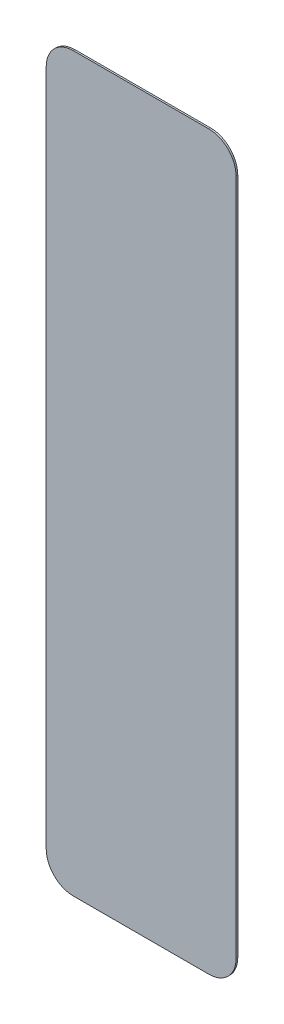
ISO-10303-21;
HEADER;
FILE_DESCRIPTION(('STEP AP214'),'2;1');
FILE_NAME('part.step','',(''),(''),'','','');
FILE_SCHEMA(('AUTOMOTIVE_DESIGN { 1 0 10303 214 1 1 1 1 }'));
ENDSEC;
DATA;
#1=APPLICATION_CONTEXT('core data for automotive mechanical design processes');
#2=APPLICATION_PROTOCOL_DEFINITION('international standard','automotive_design',2000,#1);
#3=PRODUCT_CONTEXT('',#1,'mechanical');
#4=PRODUCT('Part','Part','',(#3));
#5=PRODUCT_RELATED_PRODUCT_CATEGORY('part','',(#4));
#6=PRODUCT_DEFINITION_FORMATION('','',#4);
#7=PRODUCT_DEFINITION_CONTEXT('part definition',#1,'design');
#8=PRODUCT_DEFINITION('design','',#6,#7);
#9=PRODUCT_DEFINITION_SHAPE('','',#8);
#10=(LENGTH_UNIT() NAMED_UNIT(*) SI_UNIT(.MILLI.,.METRE.));
#11=(NAMED_UNIT(*) PLANE_ANGLE_UNIT() SI_UNIT($,.RADIAN.));
#12=(NAMED_UNIT(*) SI_UNIT($,.STERADIAN.) SOLID_ANGLE_UNIT());
#13=UNCERTAINTY_MEASURE_WITH_UNIT(LENGTH_MEASURE(1.E-05),#10,'distance_accuracy_value','');
#14=(GEOMETRIC_REPRESENTATION_CONTEXT(3) GLOBAL_UNCERTAINTY_ASSIGNED_CONTEXT((#13)) GLOBAL_UNIT_ASSIGNED_CONTEXT((#10,
#11,#12)) REPRESENTATION_CONTEXT('',''));
#15=CARTESIAN_POINT('',(0.,0.,0.));
#16=DIRECTION('',(0.,0.,1.));
#17=DIRECTION('',(1.,0.,0.));
#18=AXIS2_PLACEMENT_3D('',#15,#16,#17);
#19=CARTESIAN_POINT('',(2.,-2.,-0.127));
#20=DIRECTION('',(0.,0.,1.));
#21=DIRECTION('',(1.,0.,0.));
#22=AXIS2_PLACEMENT_3D('',#19,#20,#21);
#23=CYLINDRICAL_SURFACE('',#22,2.);
#24=CARTESIAN_POINT('',(2.,-2.,0.));
#25=DIRECTION('',(0.,0.,1.));
#26=DIRECTION('',(1.,0.,0.));
#27=AXIS2_PLACEMENT_3D('',#24,#25,#26);
#28=CIRCLE('',#27,2.);
#29=CARTESIAN_POINT('',(2.,0.,0.));
#30=VERTEX_POINT('',#29);
#31=CARTESIAN_POINT('',(0.,-2.,0.));
#32=VERTEX_POINT('',#31);
#33=EDGE_CURVE('E132',#30,#32,#28,.T.);
#34=ORIENTED_EDGE('',*,*,#33,.F.);
#35=DIRECTION('',(0.,0.,1.));
#36=VECTOR('',#35,1.);
#37=CARTESIAN_POINT('',(2.,0.,-0.127));
#38=LINE('',#37,#36);
#39=CARTESIAN_POINT('',(2.,0.,-0.127));
#40=VERTEX_POINT('',#39);
#41=EDGE_CURVE('E11',#40,#30,#38,.T.);
#42=ORIENTED_EDGE('',*,*,#41,.F.);
#43=CARTESIAN_POINT('',(2.,-2.,-0.127));
#44=DIRECTION('',(0.,0.,1.));
#45=DIRECTION('',(1.,0.,0.));
#46=AXIS2_PLACEMENT_3D('',#43,#44,#45);
#47=CIRCLE('',#46,2.);
#48=CARTESIAN_POINT('',(0.,-2.,-0.127));
#49=VERTEX_POINT('',#48);
#50=EDGE_CURVE('E152',#40,#49,#47,.T.);
#51=ORIENTED_EDGE('',*,*,#50,.T.);
#52=DIRECTION('',(0.,0.,1.));
#53=VECTOR('',#52,1.);
#54=CARTESIAN_POINT('',(0.,-2.,-0.127));
#55=LINE('',#54,#53);
#56=EDGE_CURVE('E38',#49,#32,#55,.T.);
#57=ORIENTED_EDGE('',*,*,#56,.T.);
#58=EDGE_LOOP('',(#34,#42,#51,#57));
#59=FACE_BOUND('',#58,.T.);
#60=ADVANCED_FACE('F35',(#59),#23,.T.);
#61=CARTESIAN_POINT('',(12.,0.,-0.127));
#62=DIRECTION('',(0.,1.,0.));
#63=DIRECTION('',(0.,0.,1.));
#64=AXIS2_PLACEMENT_3D('',#61,#62,#63);
#65=PLANE('',#64);
#66=DIRECTION('',(-1.,0.,0.));
#67=VECTOR('',#66,1.);
#68=CARTESIAN_POINT('',(12.,0.,0.));
#69=LINE('',#68,#67);
#70=CARTESIAN_POINT('',(12.,0.,0.));
#71=VERTEX_POINT('',#70);
#72=EDGE_CURVE('E150',#71,#30,#69,.T.);
#73=ORIENTED_EDGE('',*,*,#72,.F.);
#74=DIRECTION('',(0.,0.,1.));
#75=VECTOR('',#74,1.);
#76=CARTESIAN_POINT('',(12.,0.,-0.127));
#77=LINE('',#76,#75);
#78=CARTESIAN_POINT('',(12.,0.,-0.127));
#79=VERTEX_POINT('',#78);
#80=EDGE_CURVE('E44',#79,#71,#77,.T.);
#81=ORIENTED_EDGE('',*,*,#80,.F.);
#82=DIRECTION('',(-1.,0.,0.));
#83=VECTOR('',#82,1.);
#84=CARTESIAN_POINT('',(12.,0.,-0.127));
#85=LINE('',#84,#83);
#86=EDGE_CURVE('E122',#79,#40,#85,.T.);
#87=ORIENTED_EDGE('',*,*,#86,.T.);
#88=ORIENTED_EDGE('',*,*,#41,.T.);
#89=EDGE_LOOP('',(#73,#81,#87,#88));
#90=FACE_BOUND('',#89,.T.);
#91=ADVANCED_FACE('F164',(#90),#65,.T.);
#92=CARTESIAN_POINT('',(12.,-2.,-0.127));
#93=DIRECTION('',(0.,0.,1.));
#94=DIRECTION('',(1.,0.,0.));
#95=AXIS2_PLACEMENT_3D('',#92,#93,#94);
#96=CYLINDRICAL_SURFACE('',#95,2.);
#97=CARTESIAN_POINT('',(12.,-2.,0.));
#98=DIRECTION('',(0.,0.,1.));
#99=DIRECTION('',(1.,0.,0.));
#100=AXIS2_PLACEMENT_3D('',#97,#98,#99);
#101=CIRCLE('',#100,2.);
#102=CARTESIAN_POINT('',(14.,-2.,0.));
#103=VERTEX_POINT('',#102);
#104=EDGE_CURVE('E109',#103,#71,#101,.T.);
#105=ORIENTED_EDGE('',*,*,#104,.F.);
#106=DIRECTION('',(0.,0.,1.));
#107=VECTOR('',#106,1.);
#108=CARTESIAN_POINT('',(14.,-2.,-0.127));
#109=LINE('',#108,#107);
#110=CARTESIAN_POINT('',(14.,-2.,-0.127));
#111=VERTEX_POINT('',#110);
#112=EDGE_CURVE('E104',#111,#103,#109,.T.);
#113=ORIENTED_EDGE('',*,*,#112,.F.);
#114=CARTESIAN_POINT('',(12.,-2.,-0.127));
#115=DIRECTION('',(0.,0.,1.));
#116=DIRECTION('',(1.,0.,0.));
#117=AXIS2_PLACEMENT_3D('',#114,#115,#116);
#118=CIRCLE('',#117,2.);
#119=EDGE_CURVE('E107',#111,#79,#118,.T.);
#120=ORIENTED_EDGE('',*,*,#119,.T.);
#121=ORIENTED_EDGE('',*,*,#80,.T.);
#122=EDGE_LOOP('',(#105,#113,#120,#121));
#123=FACE_BOUND('',#122,.T.);
#124=ADVANCED_FACE('F106',(#123),#96,.T.);
#125=CARTESIAN_POINT('',(14.,-52.,-0.127));
#126=DIRECTION('',(1.,0.,0.));
#127=DIRECTION('',(0.,1.,0.));
#128=AXIS2_PLACEMENT_3D('',#125,#126,#127);
#129=PLANE('',#128);
#130=DIRECTION('',(0.,1.,0.));
#131=VECTOR('',#130,1.);
#132=CARTESIAN_POINT('',(14.,-52.,0.));
#133=LINE('',#132,#131);
#134=CARTESIAN_POINT('',(14.,-52.,0.));
#135=VERTEX_POINT('',#134);
#136=EDGE_CURVE('E147',#135,#103,#133,.T.);
#137=ORIENTED_EDGE('',*,*,#136,.F.);
#138=DIRECTION('',(0.,0.,1.));
#139=VECTOR('',#138,1.);
#140=CARTESIAN_POINT('',(14.,-52.,-0.127));
#141=LINE('',#140,#139);
#142=CARTESIAN_POINT('',(14.,-52.,-0.127));
#143=VERTEX_POINT('',#142);
#144=EDGE_CURVE('E114',#143,#135,#141,.T.);
#145=ORIENTED_EDGE('',*,*,#144,.F.);
#146=DIRECTION('',(0.,1.,0.));
#147=VECTOR('',#146,1.);
#148=CARTESIAN_POINT('',(14.,-52.,-0.127));
#149=LINE('',#148,#147);
#150=EDGE_CURVE('E120',#143,#111,#149,.T.);
#151=ORIENTED_EDGE('',*,*,#150,.T.);
#152=ORIENTED_EDGE('',*,*,#112,.T.);
#153=EDGE_LOOP('',(#137,#145,#151,#152));
#154=FACE_BOUND('',#153,.T.);
#155=ADVANCED_FACE('F124',(#154),#129,.T.);
#156=CARTESIAN_POINT('',(12.,-52.,-0.127));
#157=DIRECTION('',(0.,0.,1.));
#158=DIRECTION('',(1.,0.,0.));
#159=AXIS2_PLACEMENT_3D('',#156,#157,#158);
#160=CYLINDRICAL_SURFACE('',#159,2.);
#161=CARTESIAN_POINT('',(12.,-52.,0.));
#162=DIRECTION('',(0.,0.,1.));
#163=DIRECTION('',(1.,0.,0.));
#164=AXIS2_PLACEMENT_3D('',#161,#162,#163);
#165=CIRCLE('',#164,2.);
#166=CARTESIAN_POINT('',(12.,-54.,0.));
#167=VERTEX_POINT('',#166);
#168=EDGE_CURVE('E144',#167,#135,#165,.T.);
#169=ORIENTED_EDGE('',*,*,#168,.F.);
#170=DIRECTION('',(0.,0.,1.));
#171=VECTOR('',#170,1.);
#172=CARTESIAN_POINT('',(12.,-54.,-0.127));
#173=LINE('',#172,#171);
#174=CARTESIAN_POINT('',(12.,-54.,-0.127));
#175=VERTEX_POINT('',#174);
#176=EDGE_CURVE('E156',#175,#167,#173,.T.);
#177=ORIENTED_EDGE('',*,*,#176,.F.);
#178=CARTESIAN_POINT('',(12.,-52.,-0.127));
#179=DIRECTION('',(0.,0.,1.));
#180=DIRECTION('',(1.,0.,0.));
#181=AXIS2_PLACEMENT_3D('',#178,#179,#180);
#182=CIRCLE('',#181,2.);
#183=EDGE_CURVE('E125',#175,#143,#182,.T.);
#184=ORIENTED_EDGE('',*,*,#183,.T.);
#185=ORIENTED_EDGE('',*,*,#144,.T.);
#186=EDGE_LOOP('',(#169,#177,#184,#185));
#187=FACE_BOUND('',#186,.T.);
#188=ADVANCED_FACE('F177',(#187),#160,.T.);
#189=CARTESIAN_POINT('',(2.,-54.,-0.127));
#190=DIRECTION('',(0.,-1.,0.));
#191=DIRECTION('',(0.,0.,-1.));
#192=AXIS2_PLACEMENT_3D('',#189,#190,#191);
#193=PLANE('',#192);
#194=DIRECTION('',(1.,0.,0.));
#195=VECTOR('',#194,1.);
#196=CARTESIAN_POINT('',(2.,-54.,0.));
#197=LINE('',#196,#195);
#198=CARTESIAN_POINT('',(2.,-54.,0.));
#199=VERTEX_POINT('',#198);
#200=EDGE_CURVE('E141',#199,#167,#197,.T.);
#201=ORIENTED_EDGE('',*,*,#200,.F.);
#202=DIRECTION('',(0.,0.,1.));
#203=VECTOR('',#202,1.);
#204=CARTESIAN_POINT('',(2.,-54.,-0.127));
#205=LINE('',#204,#203);
#206=CARTESIAN_POINT('',(2.,-54.,-0.127));
#207=VERTEX_POINT('',#206);
#208=EDGE_CURVE('E158',#207,#199,#205,.T.);
#209=ORIENTED_EDGE('',*,*,#208,.F.);
#210=DIRECTION('',(1.,0.,0.));
#211=VECTOR('',#210,1.);
#212=CARTESIAN_POINT('',(2.,-54.,-0.127));
#213=LINE('',#212,#211);
#214=EDGE_CURVE('E127',#207,#175,#213,.T.);
#215=ORIENTED_EDGE('',*,*,#214,.T.);
#216=ORIENTED_EDGE('',*,*,#176,.T.);
#217=EDGE_LOOP('',(#201,#209,#215,#216));
#218=FACE_BOUND('',#217,.T.);
#219=ADVANCED_FACE('F180',(#218),#193,.T.);
#220=CARTESIAN_POINT('',(2.,-52.,-0.127));
#221=DIRECTION('',(0.,0.,1.));
#222=DIRECTION('',(1.,0.,0.));
#223=AXIS2_PLACEMENT_3D('',#220,#221,#222);
#224=CYLINDRICAL_SURFACE('',#223,2.);
#225=CARTESIAN_POINT('',(2.,-52.,0.));
#226=DIRECTION('',(0.,0.,1.));
#227=DIRECTION('',(1.,0.,0.));
#228=AXIS2_PLACEMENT_3D('',#225,#226,#227);
#229=CIRCLE('',#228,2.);
#230=CARTESIAN_POINT('',(0.,-52.,0.));
#231=VERTEX_POINT('',#230);
#232=EDGE_CURVE('E138',#231,#199,#229,.T.);
#233=ORIENTED_EDGE('',*,*,#232,.F.);
#234=DIRECTION('',(0.,0.,1.));
#235=VECTOR('',#234,1.);
#236=CARTESIAN_POINT('',(0.,-52.,-0.127));
#237=LINE('',#236,#235);
#238=CARTESIAN_POINT('',(0.,-52.,-0.127));
#239=VERTEX_POINT('',#238);
#240=EDGE_CURVE('E159',#239,#231,#237,.T.);
#241=ORIENTED_EDGE('',*,*,#240,.F.);
#242=CARTESIAN_POINT('',(2.,-52.,-0.127));
#243=DIRECTION('',(0.,0.,1.));
#244=DIRECTION('',(1.,0.,0.));
#245=AXIS2_PLACEMENT_3D('',#242,#243,#244);
#246=CIRCLE('',#245,2.);
#247=EDGE_CURVE('E255',#239,#207,#246,.T.);
#248=ORIENTED_EDGE('',*,*,#247,.T.);
#249=ORIENTED_EDGE('',*,*,#208,.T.);
#250=EDGE_LOOP('',(#233,#241,#248,#249));
#251=FACE_BOUND('',#250,.T.);
#252=ADVANCED_FACE('F184',(#251),#224,.T.);
#253=CARTESIAN_POINT('',(0.,-2.,-0.127));
#254=DIRECTION('',(-1.,0.,0.));
#255=DIRECTION('',(0.,-1.,0.));
#256=AXIS2_PLACEMENT_3D('',#253,#254,#255);
#257=PLANE('',#256);
#258=DIRECTION('',(0.,-1.,0.));
#259=VECTOR('',#258,1.);
#260=CARTESIAN_POINT('',(0.,-2.,0.));
#261=LINE('',#260,#259);
#262=EDGE_CURVE('E135',#32,#231,#261,.T.);
#263=ORIENTED_EDGE('',*,*,#262,.F.);
#264=ORIENTED_EDGE('',*,*,#56,.F.);
#265=DIRECTION('',(0.,-1.,0.));
#266=VECTOR('',#265,1.);
#267=CARTESIAN_POINT('',(0.,-2.,-0.127));
#268=LINE('',#267,#266);
#269=EDGE_CURVE('E256',#49,#239,#268,.T.);
#270=ORIENTED_EDGE('',*,*,#269,.T.);
#271=ORIENTED_EDGE('',*,*,#240,.T.);
#272=EDGE_LOOP('',(#263,#264,#270,#271));
#273=FACE_BOUND('',#272,.T.);
#274=ADVANCED_FACE('F161',(#273),#257,.T.);
#275=CARTESIAN_POINT('',(2.,-2.,-0.127));
#276=DIRECTION('',(0.,0.,1.));
#277=DIRECTION('',(1.,0.,0.));
#278=AXIS2_PLACEMENT_3D('',#275,#276,#277);
#279=PLANE('',#278);
#280=ORIENTED_EDGE('',*,*,#50,.F.);
#281=ORIENTED_EDGE('',*,*,#86,.F.);
#282=ORIENTED_EDGE('',*,*,#119,.F.);
#283=ORIENTED_EDGE('',*,*,#150,.F.);
#284=ORIENTED_EDGE('',*,*,#183,.F.);
#285=ORIENTED_EDGE('',*,*,#214,.F.);
#286=ORIENTED_EDGE('',*,*,#247,.F.);
#287=ORIENTED_EDGE('',*,*,#269,.F.);
#288=EDGE_LOOP('',(#280,#281,#282,#283,#284,#285,#286,#287));
#289=FACE_BOUND('',#288,.T.);
#290=ADVANCED_FACE('F118',(#289),#279,.F.);
#291=CARTESIAN_POINT('',(2.,-2.,0.));
#292=DIRECTION('',(0.,0.,1.));
#293=DIRECTION('',(1.,0.,0.));
#294=AXIS2_PLACEMENT_3D('',#291,#292,#293);
#295=PLANE('',#294);
#296=ORIENTED_EDGE('',*,*,#33,.T.);
#297=ORIENTED_EDGE('',*,*,#262,.T.);
#298=ORIENTED_EDGE('',*,*,#232,.T.);
#299=ORIENTED_EDGE('',*,*,#200,.T.);
#300=ORIENTED_EDGE('',*,*,#168,.T.);
#301=ORIENTED_EDGE('',*,*,#136,.T.);
#302=ORIENTED_EDGE('',*,*,#104,.T.);
#303=ORIENTED_EDGE('',*,*,#72,.T.);
#304=EDGE_LOOP('',(#296,#297,#298,#299,#300,#301,#302,#303));
#305=FACE_BOUND('',#304,.T.);
#306=ADVANCED_FACE('F163',(#305),#295,.T.);
#307=CLOSED_SHELL('',(#60,#91,#124,#155,#188,#219,#252,#274,#290,#306));
#308=MANIFOLD_SOLID_BREP('B2',#307);
#309=ADVANCED_BREP_SHAPE_REPRESENTATION('',(#18,#308),#14);
#310=SHAPE_DEFINITION_REPRESENTATION(#9,#309);
ENDSEC;
END-ISO-10303-21;
